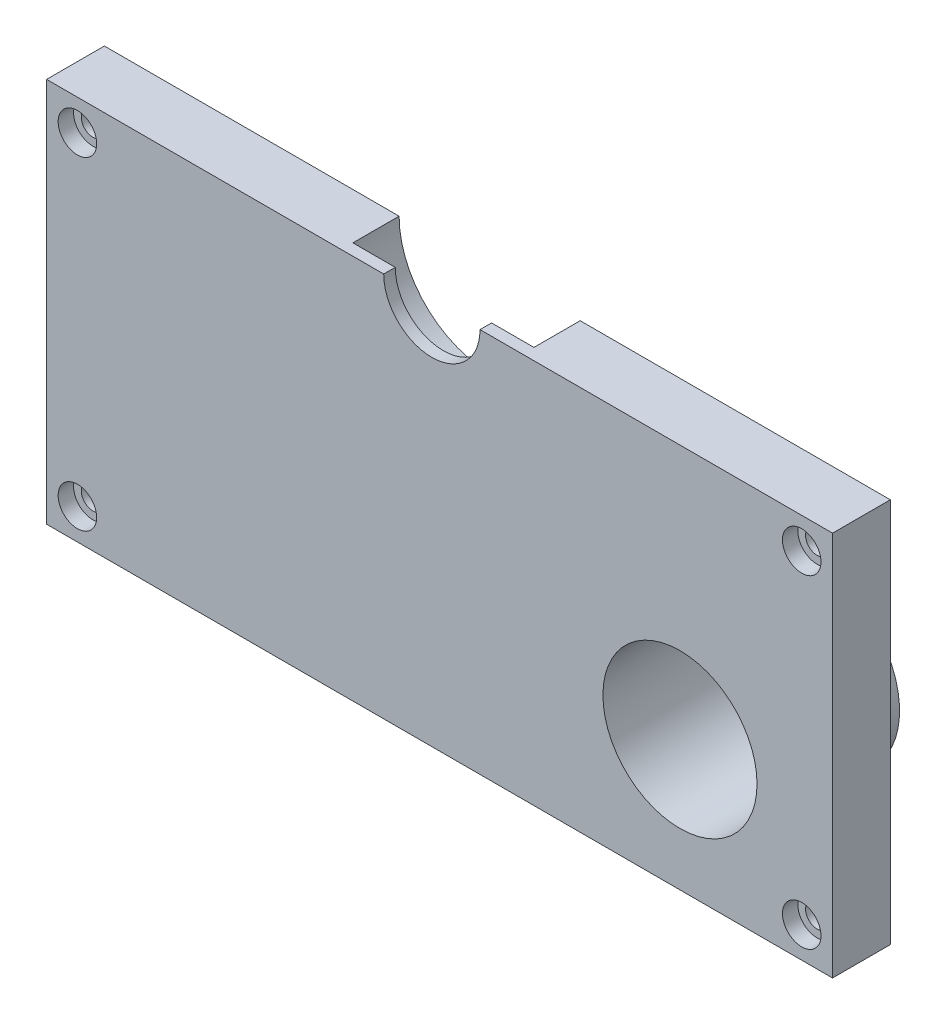
ISO-10303-21;
HEADER;
FILE_DESCRIPTION(('STEP AP214'),'2;1');
FILE_NAME('part.step','',(''),(''),'','','');
FILE_SCHEMA(('AUTOMOTIVE_DESIGN { 1 0 10303 214 1 1 1 1 }'));
ENDSEC;
DATA;
#1=APPLICATION_CONTEXT('core data for automotive mechanical design processes');
#2=APPLICATION_PROTOCOL_DEFINITION('international standard','automotive_design',2000,#1);
#3=PRODUCT_CONTEXT('',#1,'mechanical');
#4=PRODUCT('Part','Part','',(#3));
#5=PRODUCT_RELATED_PRODUCT_CATEGORY('part','',(#4));
#6=PRODUCT_DEFINITION_FORMATION('','',#4);
#7=PRODUCT_DEFINITION_CONTEXT('part definition',#1,'design');
#8=PRODUCT_DEFINITION('design','',#6,#7);
#9=PRODUCT_DEFINITION_SHAPE('','',#8);
#10=(LENGTH_UNIT() NAMED_UNIT(*) SI_UNIT(.MILLI.,.METRE.));
#11=(NAMED_UNIT(*) PLANE_ANGLE_UNIT() SI_UNIT($,.RADIAN.));
#12=(NAMED_UNIT(*) SI_UNIT($,.STERADIAN.) SOLID_ANGLE_UNIT());
#13=UNCERTAINTY_MEASURE_WITH_UNIT(LENGTH_MEASURE(1.E-05),#10,'distance_accuracy_value','');
#14=(GEOMETRIC_REPRESENTATION_CONTEXT(3) GLOBAL_UNCERTAINTY_ASSIGNED_CONTEXT((#13)) GLOBAL_UNIT_ASSIGNED_CONTEXT((#10,
#11,#12)) REPRESENTATION_CONTEXT('',''));
#15=CARTESIAN_POINT('',(0.,0.,0.));
#16=DIRECTION('',(0.,0.,1.));
#17=DIRECTION('',(1.,0.,0.));
#18=AXIS2_PLACEMENT_3D('',#15,#16,#17);
#19=CARTESIAN_POINT('',(0.,0.,4.5));
#20=DIRECTION('',(0.,0.,1.));
#21=DIRECTION('',(1.,0.,0.));
#22=AXIS2_PLACEMENT_3D('',#19,#20,#21);
#23=PLANE('',#22);
#24=CARTESIAN_POINT('',(32.2,-33.1,4.5));
#25=DIRECTION('',(0.,0.,1.));
#26=DIRECTION('',(1.,0.,0.));
#27=AXIS2_PLACEMENT_3D('',#24,#25,#26);
#28=CIRCLE('',#27,10.);
#29=CARTESIAN_POINT('',(42.2,-33.1,4.5));
#30=VERTEX_POINT('',#29);
#31=EDGE_CURVE('E380',#30,#30,#28,.F.);
#32=ORIENTED_EDGE('',*,*,#31,.T.);
#33=EDGE_LOOP('',(#32));
#34=FACE_BOUND('',#33,.T.);
#35=DIRECTION('',(-1.,0.,0.));
#36=VECTOR('',#35,1.);
#37=CARTESIAN_POINT('',(-11.25,0.,4.5));
#38=LINE('',#37,#36);
#39=CARTESIAN_POINT('',(-6.25,0.,4.5));
#40=VERTEX_POINT('',#39);
#41=CARTESIAN_POINT('',(-50.,0.,4.5));
#42=VERTEX_POINT('',#41);
#43=EDGE_CURVE('E85',#40,#42,#38,.T.);
#44=ORIENTED_EDGE('',*,*,#43,.T.);
#45=DIRECTION('',(0.,-1.,0.));
#46=VECTOR('',#45,1.);
#47=CARTESIAN_POINT('',(-50.,0.,4.5));
#48=LINE('',#47,#46);
#49=CARTESIAN_POINT('',(-50.,-50.,4.5));
#50=VERTEX_POINT('',#49);
#51=EDGE_CURVE('E183',#42,#50,#48,.T.);
#52=ORIENTED_EDGE('',*,*,#51,.T.);
#53=DIRECTION('',(1.,0.,0.));
#54=VECTOR('',#53,1.);
#55=CARTESIAN_POINT('',(-50.,-50.,4.5));
#56=LINE('',#55,#54);
#57=CARTESIAN_POINT('',(52.,-50.,4.5));
#58=VERTEX_POINT('',#57);
#59=EDGE_CURVE('E77',#50,#58,#56,.T.);
#60=ORIENTED_EDGE('',*,*,#59,.T.);
#61=DIRECTION('',(0.,-1.,0.));
#62=VECTOR('',#61,1.);
#63=CARTESIAN_POINT('',(52.,-50.,4.5));
#64=LINE('',#63,#62);
#65=CARTESIAN_POINT('',(52.,0.,4.5));
#66=VERTEX_POINT('',#65);
#67=EDGE_CURVE('E193',#66,#58,#64,.T.);
#68=ORIENTED_EDGE('',*,*,#67,.F.);
#69=DIRECTION('',(-1.,0.,0.));
#70=VECTOR('',#69,1.);
#71=CARTESIAN_POINT('',(70.,0.,4.5));
#72=LINE('',#71,#70);
#73=CARTESIAN_POINT('',(6.25,0.,4.5));
#74=VERTEX_POINT('',#73);
#75=EDGE_CURVE('E187',#66,#74,#72,.T.);
#76=ORIENTED_EDGE('',*,*,#75,.T.);
#77=CARTESIAN_POINT('',(0.,0.,4.5));
#78=DIRECTION('',(0.,0.,-1.));
#79=DIRECTION('',(1.,0.,0.));
#80=AXIS2_PLACEMENT_3D('',#77,#78,#79);
#81=CIRCLE('',#80,6.25);
#82=EDGE_CURVE('E93',#74,#40,#81,.T.);
#83=ORIENTED_EDGE('',*,*,#82,.T.);
#84=EDGE_LOOP('',(#44,#52,#60,#68,#76,#83));
#85=FACE_BOUND('',#84,.T.);
#86=CARTESIAN_POINT('',(48.,-46.,4.5));
#87=DIRECTION('',(0.,0.,1.));
#88=DIRECTION('',(1.,0.,0.));
#89=AXIS2_PLACEMENT_3D('',#86,#87,#88);
#90=CIRCLE('',#89,2.5);
#91=CARTESIAN_POINT('',(50.5,-46.,4.5));
#92=VERTEX_POINT('',#91);
#93=EDGE_CURVE('E148',#92,#92,#90,.T.);
#94=ORIENTED_EDGE('',*,*,#93,.F.);
#95=EDGE_LOOP('',(#94));
#96=FACE_BOUND('',#95,.T.);
#97=CARTESIAN_POINT('',(48.,-4.,4.5));
#98=DIRECTION('',(0.,0.,1.));
#99=DIRECTION('',(1.,0.,0.));
#100=AXIS2_PLACEMENT_3D('',#97,#98,#99);
#101=CIRCLE('',#100,2.5);
#102=CARTESIAN_POINT('',(50.5,-4.,4.5));
#103=VERTEX_POINT('',#102);
#104=EDGE_CURVE('E153',#103,#103,#101,.T.);
#105=ORIENTED_EDGE('',*,*,#104,.F.);
#106=EDGE_LOOP('',(#105));
#107=FACE_BOUND('',#106,.T.);
#108=CARTESIAN_POINT('',(-46.,-4.,4.5));
#109=DIRECTION('',(0.,0.,1.));
#110=DIRECTION('',(1.,0.,0.));
#111=AXIS2_PLACEMENT_3D('',#108,#109,#110);
#112=CIRCLE('',#111,2.5);
#113=CARTESIAN_POINT('',(-43.5,-4.,4.5));
#114=VERTEX_POINT('',#113);
#115=EDGE_CURVE('E158',#114,#114,#112,.T.);
#116=ORIENTED_EDGE('',*,*,#115,.F.);
#117=EDGE_LOOP('',(#116));
#118=FACE_BOUND('',#117,.T.);
#119=CARTESIAN_POINT('',(-46.,-46.,4.5));
#120=DIRECTION('',(0.,0.,1.));
#121=DIRECTION('',(1.,0.,0.));
#122=AXIS2_PLACEMENT_3D('',#119,#120,#121);
#123=CIRCLE('',#122,2.5);
#124=CARTESIAN_POINT('',(-43.5,-46.,4.5));
#125=VERTEX_POINT('',#124);
#126=EDGE_CURVE('E143',#125,#125,#123,.T.);
#127=ORIENTED_EDGE('',*,*,#126,.F.);
#128=EDGE_LOOP('',(#127));
#129=FACE_BOUND('',#128,.T.);
#130=ADVANCED_FACE('F35',(#34,#85,#96,#107,#118,#129),#23,.T.);
#131=CARTESIAN_POINT('',(32.2,-33.1,42.1126983722081));
#132=DIRECTION('',(0.,0.,-1.));
#133=DIRECTION('',(-1.,0.,0.));
#134=AXIS2_PLACEMENT_3D('',#131,#132,#133);
#135=CYLINDRICAL_SURFACE('',#134,11.);
#136=CARTESIAN_POINT('',(32.2,-22.1,-9.50000000000001));
#137=CARTESIAN_POINT('',(32.1161615865701,-22.1000012532738,-9.49999648054263));
#138=CARTESIAN_POINT('',(32.0322723977102,-22.1009685728513,-9.49294740732744));
#139=CARTESIAN_POINT('',(31.8668329023586,-22.1047343359155,-9.46494111677572));
#140=CARTESIAN_POINT('',(31.7852850543401,-22.107534635599,-9.44396980055017));
#141=CARTESIAN_POINT('',(31.6269469063064,-22.1146512260171,-9.38875226615938));
#142=CARTESIAN_POINT('',(31.5501532775468,-22.1189664416081,-9.35451546079792));
#143=CARTESIAN_POINT('',(31.4034146975503,-22.128634272777,-9.27376047543979));
#144=CARTESIAN_POINT('',(31.3334686711413,-22.1339867250995,-9.22724422774572));
#145=CARTESIAN_POINT('',(31.2019424361877,-22.1451714003075,-9.12292778570769));
#146=CARTESIAN_POINT('',(31.1404132153762,-22.1510062309478,-9.06506357699654));
#147=CARTESIAN_POINT('',(31.0279066609196,-22.1624772844068,-8.93983138920762));
#148=CARTESIAN_POINT('',(30.976929893872,-22.1681134965475,-8.87246290013868));
#149=CARTESIAN_POINT('',(30.8867814947508,-22.1785746222812,-8.72979806177589));
#150=CARTESIAN_POINT('',(30.847658335316,-22.183396169892,-8.65447081499479));
#151=CARTESIAN_POINT('',(30.7826373551472,-22.1916470593224,-8.49823818462633));
#152=CARTESIAN_POINT('',(30.7567389389201,-22.195076463827,-8.4173330523902));
#153=CARTESIAN_POINT('',(30.7190590944491,-22.2001295030783,-8.25277375642641));
#154=CARTESIAN_POINT('',(30.7071910113545,-22.2017642177551,-8.16913978070894));
#155=CARTESIAN_POINT('',(30.6976404494033,-22.2030765619518,-8.00105252697592));
#156=CARTESIAN_POINT('',(30.6999572950202,-22.2027542846692,-7.91659928816724));
#157=CARTESIAN_POINT('',(30.7186398298076,-22.2001991966344,-7.7498782743991));
#158=CARTESIAN_POINT('',(30.7349096108241,-22.1979794289804,-7.66759952363283));
#159=CARTESIAN_POINT('',(30.780886323047,-22.1918998259182,-7.50695095946735));
#160=CARTESIAN_POINT('',(30.8105935734975,-22.188039951545,-7.42858123898703));
#161=CARTESIAN_POINT('',(30.8827035823979,-22.179100417063,-7.27768007396237));
#162=CARTESIAN_POINT('',(30.9251475614224,-22.1740168072425,-7.20516857073199));
#163=CARTESIAN_POINT('',(31.0214967695518,-22.1632055566531,-7.06826085111422));
#164=CARTESIAN_POINT('',(31.0754026217696,-22.1574778808782,-7.00386507623326));
#165=CARTESIAN_POINT('',(31.193674722162,-22.145966026102,-6.88446044550542));
#166=CARTESIAN_POINT('',(31.2581235492658,-22.1401817705892,-6.82953335968757));
#167=CARTESIAN_POINT('',(31.3953690555946,-22.1292525294221,-6.73126350840162));
#168=CARTESIAN_POINT('',(31.4681657608354,-22.1241075457602,-6.68792077903695));
#169=CARTESIAN_POINT('',(31.6201070305195,-22.1150324591229,-6.61404813681996));
#170=CARTESIAN_POINT('',(31.6992543678687,-22.1111028905153,-6.58352385760728));
#171=CARTESIAN_POINT('',(31.8616169120601,-22.1049060479693,-6.5362221620544));
#172=CARTESIAN_POINT('',(31.9448318917199,-22.102638681308,-6.51944397890651));
#173=CARTESIAN_POINT('',(32.1122610926323,-22.1000338619625,-6.50021791543441));
#174=CARTESIAN_POINT('',(32.1964621636121,-22.0996812530986,-6.49765749141139));
#175=CARTESIAN_POINT('',(32.3640922940892,-22.1009046122902,-6.50664187833073));
#176=CARTESIAN_POINT('',(32.4475213731804,-22.1024805312617,-6.51818633028291));
#177=CARTESIAN_POINT('',(32.6109033783649,-22.1073744734208,-6.55495922320966));
#178=CARTESIAN_POINT('',(32.6908687206206,-22.1106855987668,-6.58013349557132));
#179=CARTESIAN_POINT('',(32.8454431410956,-22.1186795593637,-6.64339475903291));
#180=CARTESIAN_POINT('',(32.9200520064252,-22.1233624490969,-6.68148226301717));
#181=CARTESIAN_POINT('',(33.0622948929825,-22.1336163696397,-6.76975753872403));
#182=CARTESIAN_POINT('',(33.1298837283532,-22.139192629429,-6.82001750280037));
#183=CARTESIAN_POINT('',(33.2557070132546,-22.1505944685733,-6.93110957795735));
#184=CARTESIAN_POINT('',(33.3139410174533,-22.1564200597808,-6.99194219205666));
#185=CARTESIAN_POINT('',(33.4198053295411,-22.1677113122697,-7.1229508330084));
#186=CARTESIAN_POINT('',(33.4673606638064,-22.1731742498786,-7.19318771348107));
#187=CARTESIAN_POINT('',(33.5499983954927,-22.1830753495584,-7.34071830769976));
#188=CARTESIAN_POINT('',(33.5850810819614,-22.1875135353766,-7.41801185785857));
#189=CARTESIAN_POINT('',(33.6416584950515,-22.1948435273933,-7.57722775667319));
#190=CARTESIAN_POINT('',(33.6631942705001,-22.197740001028,-7.65913529443613));
#191=CARTESIAN_POINT('',(33.6921981054752,-22.2016715683977,-7.82544652182803));
#192=CARTESIAN_POINT('',(33.699666954979,-22.2027067666591,-7.90985007101435));
#193=CARTESIAN_POINT('',(33.7003085658472,-22.2027951458473,-8.07801097539096));
#194=CARTESIAN_POINT('',(33.6935991469064,-22.2018646613795,-8.1617678966084));
#195=CARTESIAN_POINT('',(33.6663254643853,-22.1981617994635,-8.32695113869849));
#196=CARTESIAN_POINT('',(33.6457612087119,-22.1953894230665,-8.40837746090115));
#197=CARTESIAN_POINT('',(33.5914005645048,-22.1883204918021,-8.56656513938514));
#198=CARTESIAN_POINT('',(33.5576109698069,-22.1840247196071,-8.64332886748254));
#199=CARTESIAN_POINT('',(33.4777703983912,-22.174391888755,-8.79011629860636));
#200=CARTESIAN_POINT('',(33.4317191536582,-22.1690548073377,-8.86013985426055));
#201=CARTESIAN_POINT('',(33.3282291522308,-22.1578877007815,-8.99206003659979));
#202=CARTESIAN_POINT('',(33.270702784234,-22.1520540943964,-9.05388763622252));
#203=CARTESIAN_POINT('',(33.1460798680536,-22.1405821269644,-9.16705534671079));
#204=CARTESIAN_POINT('',(33.0789810819578,-22.1349438119584,-9.21839299831137));
#205=CARTESIAN_POINT('',(32.936765493202,-22.1244690703008,-9.30932596738337));
#206=CARTESIAN_POINT('',(32.8616138185174,-22.1196363835438,-9.34886715827633));
#207=CARTESIAN_POINT('',(32.7057096939303,-22.1113546294284,-9.41470948105298));
#208=CARTESIAN_POINT('',(32.6249633120219,-22.1079040897228,-9.44102470969371));
#209=CARTESIAN_POINT('',(32.4865185970872,-22.1035882393269,-9.47351043706395));
#210=CARTESIAN_POINT('',(32.4296857886961,-22.1022493572114,-9.48342936079735));
#211=CARTESIAN_POINT('',(32.3152433136469,-22.1004548109262,-9.49667532098122));
#212=CARTESIAN_POINT('',(32.2576336542977,-22.0999991384528,-9.50000241940636));
#213=CARTESIAN_POINT('',(32.2,-22.1,-9.50000000000001));
#214=B_SPLINE_CURVE_WITH_KNOTS('',3,(#136,#137,#138,#139,#140,#141,#142,#143,#144,#145,#146,
#147,#148,#149,#150,#151,#152,#153,#154,#155,#156,#157,#158,#159,#160,#161,#162,#163,#164,#165,
#166,#167,#168,#169,#170,#171,#172,#173,#174,#175,#176,#177,#178,#179,#180,#181,#182,#183,#184,
#185,#186,#187,#188,#189,#190,#191,#192,#193,#194,#195,#196,#197,#198,#199,#200,#201,#202,#203,
#204,#205,#206,#207,#208,#209,#210,#211,#212,#213),.UNSPECIFIED.,.T.,.F.,(4,2,2,2,2,2,2,2,2,2,2,
2,2,2,2,2,2,2,2,2,2,2,2,2,2,2,2,2,2,2,2,2,2,2,2,2,2,2,4),(0.,0.251304688086151,
0.502864258429492,0.754245655375319,1.00558751830525,1.25839025869503,1.51120656941612,
1.76504317927172,2.0188683581839,2.27111752000618,2.52335466910192,2.77387178872724,
3.02439486038875,3.27573762185035,3.52709405079555,3.7805228474684,4.03395243396011,
4.28749328511463,4.54101999186671,4.79253696204825,5.0440475308801,5.29456578809545,
5.54509399649484,5.79714607697894,6.04921015271755,6.3029921512941,6.55676826820731,
6.80977166004954,7.06276084317862,7.31365598745062,7.56455098853994,7.81531727406243,
8.06608904128422,8.31885423544372,8.57167862009412,8.8256458202468,9.07934175494261,
9.25209960062624,9.42485582207676),.UNSPECIFIED.);
#215=CARTESIAN_POINT('',(32.2,-22.1,-9.50000000000001));
#216=VERTEX_POINT('',#215);
#217=EDGE_CURVE('E44',#216,#216,#214,.T.);
#218=ORIENTED_EDGE('',*,*,#217,.T.);
#219=EDGE_LOOP('',(#218));
#220=FACE_BOUND('',#219,.T.);
#221=ADVANCED_FACE('F252',(#220),#135,.T.);
#222=CARTESIAN_POINT('',(32.2,-18.,-8.));
#223=DIRECTION('',(0.,-1.,0.));
#224=DIRECTION('',(0.,0.,-1.));
#225=AXIS2_PLACEMENT_3D('',#222,#223,#224);
#226=CYLINDRICAL_SURFACE('',#225,1.5);
#227=CARTESIAN_POINT('',(32.2,-18.,-8.));
#228=DIRECTION('',(0.,1.,0.));
#229=DIRECTION('',(0.,0.,1.));
#230=AXIS2_PLACEMENT_3D('',#227,#228,#229);
#231=CIRCLE('',#230,1.5);
#232=CARTESIAN_POINT('',(32.2,-18.,-6.5));
#233=VERTEX_POINT('',#232);
#234=EDGE_CURVE('E231',#233,#233,#231,.T.);
#235=ORIENTED_EDGE('',*,*,#234,.T.);
#236=EDGE_LOOP('',(#235));
#237=FACE_BOUND('',#236,.T.);
#238=ORIENTED_EDGE('',*,*,#217,.F.);
#239=EDGE_LOOP('',(#238));
#240=FACE_BOUND('',#239,.T.);
#241=ADVANCED_FACE('F37',(#237,#240),#226,.F.);
#242=CARTESIAN_POINT('',(32.2,-18.,-8.));
#243=DIRECTION('',(0.,1.,0.));
#244=DIRECTION('',(0.,0.,1.));
#245=AXIS2_PLACEMENT_3D('',#242,#243,#244);
#246=PLANE('',#245);
#247=CARTESIAN_POINT('',(32.2,-18.,-8.));
#248=DIRECTION('',(0.,1.,0.));
#249=DIRECTION('',(0.,0.,1.));
#250=AXIS2_PLACEMENT_3D('',#247,#248,#249);
#251=CIRCLE('',#250,3.);
#252=CARTESIAN_POINT('',(32.2,-18.,-5.));
#253=VERTEX_POINT('',#252);
#254=EDGE_CURVE('E636',#253,#253,#251,.T.);
#255=ORIENTED_EDGE('',*,*,#254,.T.);
#256=EDGE_LOOP('',(#255));
#257=FACE_BOUND('',#256,.T.);
#258=ORIENTED_EDGE('',*,*,#234,.F.);
#259=EDGE_LOOP('',(#258));
#260=FACE_BOUND('',#259,.T.);
#261=ADVANCED_FACE('F243',(#257,#260),#246,.T.);
#262=CARTESIAN_POINT('',(32.2,-18.,-8.));
#263=DIRECTION('',(0.,-1.,0.));
#264=DIRECTION('',(0.,0.,-1.));
#265=AXIS2_PLACEMENT_3D('',#262,#263,#264);
#266=CYLINDRICAL_SURFACE('',#265,3.);
#267=ORIENTED_EDGE('',*,*,#254,.F.);
#268=EDGE_LOOP('',(#267));
#269=FACE_BOUND('',#268,.T.);
#270=CARTESIAN_POINT('',(32.2,-22.1,-11.));
#271=CARTESIAN_POINT('',(32.0347581733356,-22.1000023456518,-10.9999963747779));
#272=CARTESIAN_POINT('',(31.8694780423746,-22.1037598547848,-10.9863018728332));
#273=CARTESIAN_POINT('',(31.5436881396846,-22.118384038291,-10.9319883393936));
#274=CARTESIAN_POINT('',(31.3831805440455,-22.12925390519,-10.8913572167428));
#275=CARTESIAN_POINT('',(31.0716847478892,-22.1569045565173,-10.7845965365232));
#276=CARTESIAN_POINT('',(30.9206842660597,-22.1736775226121,-10.7185006946762));
#277=CARTESIAN_POINT('',(30.6319110076806,-22.2113669117431,-10.5628141346752));
#278=CARTESIAN_POINT('',(30.4941392734204,-22.2322836608697,-10.4732215672921));
#279=CARTESIAN_POINT('',(30.2324061048535,-22.2765720591588,-10.2708003270655));
#280=CARTESIAN_POINT('',(30.1088097416601,-22.2999871701914,-10.1575091182916));
#281=CARTESIAN_POINT('',(29.8821141263504,-22.3463577412988,-9.9118947279402));
#282=CARTESIAN_POINT('',(29.7790176435056,-22.3693131388959,-9.77956897919538));
#283=CARTESIAN_POINT('',(29.59444410921,-22.4126123167268,-9.49669750484106));
#284=CARTESIAN_POINT('',(29.5133914632483,-22.4329013988275,-9.34586571012744));
#285=CARTESIAN_POINT('',(29.3779416727754,-22.4679298517617,-9.03207234360125));
#286=CARTESIAN_POINT('',(29.3235393610631,-22.4826702982849,-8.86911313022302));
#287=CARTESIAN_POINT('',(29.2442108711746,-22.5044830561452,-8.53974420997507));
#288=CARTESIAN_POINT('',(29.2186207891354,-22.5117277543243,-8.37350610367617));
#289=CARTESIAN_POINT('',(29.1955727118173,-22.5182434183184,-8.03895063398238));
#290=CARTESIAN_POINT('',(29.1981091971823,-22.5175159485348,-7.87063368499996));
#291=CARTESIAN_POINT('',(29.230716164394,-22.5083235024909,-7.54191689806746));
#292=CARTESIAN_POINT('',(29.2599785266213,-22.5000856337266,-7.38142953079553));
#293=CARTESIAN_POINT('',(29.3439103225639,-22.4771648841188,-7.06773342795438));
#294=CARTESIAN_POINT('',(29.398581869907,-22.4624814671169,-6.91452529906741));
#295=CARTESIAN_POINT('',(29.5324274034706,-22.4281276341535,-6.61765295890509));
#296=CARTESIAN_POINT('',(29.611880962341,-22.4084008047172,-6.47412159793276));
#297=CARTESIAN_POINT('',(29.7928402395565,-22.3662126240442,-6.20214710518067));
#298=CARTESIAN_POINT('',(29.8943504778758,-22.343750712735,-6.07370707432251));
#299=CARTESIAN_POINT('',(30.1206530663421,-22.2976821001879,-5.83094962038713));
#300=CARTESIAN_POINT('',(30.2461227076655,-22.2740625140577,-5.71726510142212));
#301=CARTESIAN_POINT('',(30.5146359764227,-22.2290270458404,-5.51241807004442));
#302=CARTESIAN_POINT('',(30.6576803605629,-22.2076112587142,-5.42125652790076));
#303=CARTESIAN_POINT('',(30.9582920925207,-22.1692544375748,-5.26374665445015));
#304=CARTESIAN_POINT('',(31.1159247251644,-22.1523349742539,-5.19751732283211));
#305=CARTESIAN_POINT('',(31.4406546225712,-22.1250328771478,-5.09268405497171));
#306=CARTESIAN_POINT('',(31.6077497113646,-22.1146487471087,-5.05407379511172));
#307=CARTESIAN_POINT('',(31.9412636590335,-22.1018154244738,-5.00657876440605));
#308=CARTESIAN_POINT('',(32.107551404432,-22.0991367374926,-4.99683400935927));
#309=CARTESIAN_POINT('',(32.4393867312759,-22.1013539682973,-5.00496549502686));
#310=CARTESIAN_POINT('',(32.604934391065,-22.1062490643399,-5.02283873923299));
#311=CARTESIAN_POINT('',(32.9274901954791,-22.122915214681,-5.08499500540627));
#312=CARTESIAN_POINT('',(33.0845986485453,-22.1345602705581,-5.12879438551397));
#313=CARTESIAN_POINT('',(33.3892197348973,-22.1634015292865,-5.24099448928101));
#314=CARTESIAN_POINT('',(33.53673130261,-22.1805983473082,-5.30939793932271));
#315=CARTESIAN_POINT('',(33.8212823223891,-22.2191685234369,-5.47043288457121));
#316=CARTESIAN_POINT('',(33.958049204825,-22.2406194090113,-5.56352697452255));
#317=CARTESIAN_POINT('',(34.2143204402618,-22.2852202317904,-5.77072257509104));
#318=CARTESIAN_POINT('',(34.333821212356,-22.3083705199458,-5.88482843231709));
#319=CARTESIAN_POINT('',(34.5558212068855,-22.3546119688643,-6.13482807606764));
#320=CARTESIAN_POINT('',(34.6577125549415,-22.3776811004517,-6.27126676454985));
#321=CARTESIAN_POINT('',(34.8371716441621,-22.4203994761144,-6.55979729444655));
#322=CARTESIAN_POINT('',(34.9147403585293,-22.4400488570075,-6.71188850924513));
#323=CARTESIAN_POINT('',(35.0427711663376,-22.4734750264053,-7.02668125646437));
#324=CARTESIAN_POINT('',(35.0933870461064,-22.4872850377454,-7.18931652096057));
#325=CARTESIAN_POINT('',(35.1664183443807,-22.5074637076588,-7.52123367595563));
#326=CARTESIAN_POINT('',(35.1888413772566,-22.513834375429,-7.69051375906857));
#327=CARTESIAN_POINT('',(35.2043979115442,-22.5182398065005,-8.02467680767057));
#328=CARTESIAN_POINT('',(35.1985106643339,-22.5165532811915,-8.18951117749585));
#329=CARTESIAN_POINT('',(35.1598967528693,-22.5056899667092,-8.51574129550562));
#330=CARTESIAN_POINT('',(35.1271708405703,-22.4965133873894,-8.67713713989941));
#331=CARTESIAN_POINT('',(35.0363881687061,-22.4718736697809,-8.99061263153778));
#332=CARTESIAN_POINT('',(34.9785479089835,-22.4564643373809,-9.14275950647964));
#333=CARTESIAN_POINT('',(34.8393460908267,-22.4210962003435,-9.43530655363056));
#334=CARTESIAN_POINT('',(34.7579806900888,-22.4011366526434,-9.5757048021314));
#335=CARTESIAN_POINT('',(34.5711086196973,-22.3581524123349,-9.8454211953842));
#336=CARTESIAN_POINT('',(34.4649380364426,-22.3350524830871,-9.97426740968593));
#337=CARTESIAN_POINT('',(34.2327202239854,-22.2888001901906,-10.2126328135895));
#338=CARTESIAN_POINT('',(34.106668118776,-22.265647815056,-10.3221472480107));
#339=CARTESIAN_POINT('',(33.8348154513722,-22.2212708164507,-10.5211892290387));
#340=CARTESIAN_POINT('',(33.688631732525,-22.2001018449233,-10.6102069617339));
#341=CARTESIAN_POINT('',(33.3827997996786,-22.1626947243925,-10.762264872423));
#342=CARTESIAN_POINT('',(33.2231599048424,-22.1464535569762,-10.8253209611087));
#343=CARTESIAN_POINT('',(32.9202002024364,-22.1227161200847,-10.915879019958));
#344=CARTESIAN_POINT('',(32.7781292805249,-22.1142610463782,-10.9473491024834));
#345=CARTESIAN_POINT('',(32.490715215883,-22.102902256713,-10.9894100506377));
#346=CARTESIAN_POINT('',(32.3453724311299,-22.0999979363996,-11.0000031893096));
#347=CARTESIAN_POINT('',(32.2,-22.1,-11.));
#348=B_SPLINE_CURVE_WITH_KNOTS('',3,(#270,#271,#272,#273,#274,#275,#276,#277,#278,#279,#280,
#281,#282,#283,#284,#285,#286,#287,#288,#289,#290,#291,#292,#293,#294,#295,#296,#297,#298,#299,
#300,#301,#302,#303,#304,#305,#306,#307,#308,#309,#310,#311,#312,#313,#314,#315,#316,#317,#318,
#319,#320,#321,#322,#323,#324,#325,#326,#327,#328,#329,#330,#331,#332,#333,#334,#335,#336,#337,
#338,#339,#340,#341,#342,#343,#344,#345,#346,#347),.UNSPECIFIED.,.T.,.F.,(4,2,2,2,2,2,2,2,2,2,2,
2,2,2,2,2,2,2,2,2,2,2,2,2,2,2,2,2,2,2,2,2,2,2,2,2,2,2,4),(0.,0.495192213709797,0.9906068571026,
1.48536780484116,1.98016770272941,2.48571756446357,2.99133567318647,3.50609187300439,
4.02074822781993,4.52328609721851,5.02572535393076,5.51345773349774,6.00123069167434,
6.49471853535856,6.98830760278243,7.4987705710155,8.00925552568848,8.52214699472057,
9.03492099533888,9.53225622686166,10.029537502105,10.5178222240039,11.0061610695167,
11.5043893801936,12.0027208731201,12.5158014612974,13.0288615173582,13.5389619291417,
14.0489245425547,14.5413770446734,15.0338157499215,15.5220911132461,16.0104462704815,
16.5137802279716,17.0172378222293,17.532117445911,18.0466810522785,18.4823766419936,
18.9180247913559),.UNSPECIFIED.);
#349=CARTESIAN_POINT('',(32.2,-22.1,-11.));
#350=VERTEX_POINT('',#349);
#351=EDGE_CURVE('E220',#350,#350,#348,.T.);
#352=ORIENTED_EDGE('',*,*,#351,.T.);
#353=EDGE_LOOP('',(#352));
#354=FACE_BOUND('',#353,.T.);
#355=ADVANCED_FACE('F239',(#269,#354),#266,.T.);
#356=CARTESIAN_POINT('',(-46.,-46.,-5.5));
#357=DIRECTION('',(0.,0.,1.));
#358=DIRECTION('',(1.,0.,0.));
#359=AXIS2_PLACEMENT_3D('',#356,#357,#358);
#360=CYLINDRICAL_SURFACE('',#359,1.5);
#361=CARTESIAN_POINT('',(-46.,-46.,-3.));
#362=DIRECTION('',(0.,0.,-1.));
#363=DIRECTION('',(-1.,0.,0.));
#364=AXIS2_PLACEMENT_3D('',#361,#362,#363);
#365=CIRCLE('',#364,1.5);
#366=CARTESIAN_POINT('',(-47.5,-46.,-3.));
#367=VERTEX_POINT('',#366);
#368=EDGE_CURVE('E136',#367,#367,#365,.T.);
#369=ORIENTED_EDGE('',*,*,#368,.T.);
#370=EDGE_LOOP('',(#369));
#371=FACE_BOUND('',#370,.T.);
#372=CARTESIAN_POINT('',(-46.,-46.,2.5));
#373=DIRECTION('',(0.,0.,1.));
#374=DIRECTION('',(1.,0.,0.));
#375=AXIS2_PLACEMENT_3D('',#372,#373,#374);
#376=CIRCLE('',#375,1.5);
#377=CARTESIAN_POINT('',(-44.5,-46.,2.5));
#378=VERTEX_POINT('',#377);
#379=EDGE_CURVE('E140',#378,#378,#376,.F.);
#380=ORIENTED_EDGE('',*,*,#379,.F.);
#381=EDGE_LOOP('',(#380));
#382=FACE_BOUND('',#381,.T.);
#383=ADVANCED_FACE('F242',(#371,#382),#360,.F.);
#384=CARTESIAN_POINT('',(-46.,-46.,2.5));
#385=DIRECTION('',(0.,0.,1.));
#386=DIRECTION('',(1.,0.,0.));
#387=AXIS2_PLACEMENT_3D('',#384,#385,#386);
#388=PLANE('',#387);
#389=CARTESIAN_POINT('',(-46.,-46.,2.5));
#390=DIRECTION('',(0.,0.,1.));
#391=DIRECTION('',(1.,0.,0.));
#392=AXIS2_PLACEMENT_3D('',#389,#390,#391);
#393=CIRCLE('',#392,2.5);
#394=CARTESIAN_POINT('',(-43.5,-46.,2.5));
#395=VERTEX_POINT('',#394);
#396=EDGE_CURVE('E144',#395,#395,#393,.T.);
#397=ORIENTED_EDGE('',*,*,#396,.T.);
#398=EDGE_LOOP('',(#397));
#399=FACE_BOUND('',#398,.T.);
#400=ORIENTED_EDGE('',*,*,#379,.T.);
#401=EDGE_LOOP('',(#400));
#402=FACE_BOUND('',#401,.T.);
#403=ADVANCED_FACE('F306',(#399,#402),#388,.T.);
#404=CARTESIAN_POINT('',(-46.,-46.,2.5));
#405=DIRECTION('',(0.,0.,1.));
#406=DIRECTION('',(1.,0.,0.));
#407=AXIS2_PLACEMENT_3D('',#404,#405,#406);
#408=CYLINDRICAL_SURFACE('',#407,2.5);
#409=ORIENTED_EDGE('',*,*,#396,.F.);
#410=EDGE_LOOP('',(#409));
#411=FACE_BOUND('',#410,.T.);
#412=ORIENTED_EDGE('',*,*,#126,.T.);
#413=EDGE_LOOP('',(#412));
#414=FACE_BOUND('',#413,.T.);
#415=ADVANCED_FACE('F311',(#411,#414),#408,.F.);
#416=CARTESIAN_POINT('',(-46.,-4.,-5.5));
#417=DIRECTION('',(0.,0.,1.));
#418=DIRECTION('',(1.,0.,0.));
#419=AXIS2_PLACEMENT_3D('',#416,#417,#418);
#420=CYLINDRICAL_SURFACE('',#419,1.5);
#421=CARTESIAN_POINT('',(-46.,-4.,-3.));
#422=DIRECTION('',(0.,0.,-1.));
#423=DIRECTION('',(-1.,0.,0.));
#424=AXIS2_PLACEMENT_3D('',#421,#422,#423);
#425=CIRCLE('',#424,1.5);
#426=CARTESIAN_POINT('',(-47.5,-4.,-3.));
#427=VERTEX_POINT('',#426);
#428=EDGE_CURVE('E172',#427,#427,#425,.T.);
#429=ORIENTED_EDGE('',*,*,#428,.T.);
#430=EDGE_LOOP('',(#429));
#431=FACE_BOUND('',#430,.T.);
#432=CARTESIAN_POINT('',(-46.,-4.,2.5));
#433=DIRECTION('',(0.,0.,1.));
#434=DIRECTION('',(1.,0.,0.));
#435=AXIS2_PLACEMENT_3D('',#432,#433,#434);
#436=CIRCLE('',#435,1.5);
#437=CARTESIAN_POINT('',(-44.5,-4.,2.5));
#438=VERTEX_POINT('',#437);
#439=EDGE_CURVE('E155',#438,#438,#436,.F.);
#440=ORIENTED_EDGE('',*,*,#439,.F.);
#441=EDGE_LOOP('',(#440));
#442=FACE_BOUND('',#441,.T.);
#443=ADVANCED_FACE('F318',(#431,#442),#420,.F.);
#444=CARTESIAN_POINT('',(-46.,-4.,2.5));
#445=DIRECTION('',(0.,0.,1.));
#446=DIRECTION('',(1.,0.,0.));
#447=AXIS2_PLACEMENT_3D('',#444,#445,#446);
#448=PLANE('',#447);
#449=CARTESIAN_POINT('',(-46.,-4.,2.5));
#450=DIRECTION('',(0.,0.,1.));
#451=DIRECTION('',(1.,0.,0.));
#452=AXIS2_PLACEMENT_3D('',#449,#450,#451);
#453=CIRCLE('',#452,2.5);
#454=CARTESIAN_POINT('',(-43.5,-4.,2.5));
#455=VERTEX_POINT('',#454);
#456=EDGE_CURVE('E159',#455,#455,#453,.T.);
#457=ORIENTED_EDGE('',*,*,#456,.T.);
#458=EDGE_LOOP('',(#457));
#459=FACE_BOUND('',#458,.T.);
#460=ORIENTED_EDGE('',*,*,#439,.T.);
#461=EDGE_LOOP('',(#460));
#462=FACE_BOUND('',#461,.T.);
#463=ADVANCED_FACE('F335',(#459,#462),#448,.T.);
#464=CARTESIAN_POINT('',(-46.,-4.,2.5));
#465=DIRECTION('',(0.,0.,1.));
#466=DIRECTION('',(1.,0.,0.));
#467=AXIS2_PLACEMENT_3D('',#464,#465,#466);
#468=CYLINDRICAL_SURFACE('',#467,2.5);
#469=ORIENTED_EDGE('',*,*,#456,.F.);
#470=EDGE_LOOP('',(#469));
#471=FACE_BOUND('',#470,.T.);
#472=ORIENTED_EDGE('',*,*,#115,.T.);
#473=EDGE_LOOP('',(#472));
#474=FACE_BOUND('',#473,.T.);
#475=ADVANCED_FACE('F338',(#471,#474),#468,.F.);
#476=CARTESIAN_POINT('',(48.,-4.,-5.5));
#477=DIRECTION('',(0.,0.,1.));
#478=DIRECTION('',(1.,0.,0.));
#479=AXIS2_PLACEMENT_3D('',#476,#477,#478);
#480=CYLINDRICAL_SURFACE('',#479,1.5);
#481=CARTESIAN_POINT('',(48.,-4.,-3.));
#482=DIRECTION('',(0.,0.,-1.));
#483=DIRECTION('',(-1.,0.,0.));
#484=AXIS2_PLACEMENT_3D('',#481,#482,#483);
#485=CIRCLE('',#484,1.5);
#486=CARTESIAN_POINT('',(46.5,-4.,-3.));
#487=VERTEX_POINT('',#486);
#488=EDGE_CURVE('E198',#487,#487,#485,.T.);
#489=ORIENTED_EDGE('',*,*,#488,.T.);
#490=EDGE_LOOP('',(#489));
#491=FACE_BOUND('',#490,.T.);
#492=CARTESIAN_POINT('',(48.,-4.,2.5));
#493=DIRECTION('',(0.,0.,1.));
#494=DIRECTION('',(1.,0.,0.));
#495=AXIS2_PLACEMENT_3D('',#492,#493,#494);
#496=CIRCLE('',#495,1.5);
#497=CARTESIAN_POINT('',(49.5,-4.,2.5));
#498=VERTEX_POINT('',#497);
#499=EDGE_CURVE('E150',#498,#498,#496,.F.);
#500=ORIENTED_EDGE('',*,*,#499,.F.);
#501=EDGE_LOOP('',(#500));
#502=FACE_BOUND('',#501,.T.);
#503=ADVANCED_FACE('F330',(#491,#502),#480,.F.);
#504=CARTESIAN_POINT('',(48.,-4.,2.5));
#505=DIRECTION('',(0.,0.,1.));
#506=DIRECTION('',(1.,0.,0.));
#507=AXIS2_PLACEMENT_3D('',#504,#505,#506);
#508=PLANE('',#507);
#509=CARTESIAN_POINT('',(48.,-4.,2.5));
#510=DIRECTION('',(0.,0.,1.));
#511=DIRECTION('',(1.,0.,0.));
#512=AXIS2_PLACEMENT_3D('',#509,#510,#511);
#513=CIRCLE('',#512,2.5);
#514=CARTESIAN_POINT('',(50.5,-4.,2.5));
#515=VERTEX_POINT('',#514);
#516=EDGE_CURVE('E154',#515,#515,#513,.T.);
#517=ORIENTED_EDGE('',*,*,#516,.T.);
#518=EDGE_LOOP('',(#517));
#519=FACE_BOUND('',#518,.T.);
#520=ORIENTED_EDGE('',*,*,#499,.T.);
#521=EDGE_LOOP('',(#520));
#522=FACE_BOUND('',#521,.T.);
#523=ADVANCED_FACE('F326',(#519,#522),#508,.T.);
#524=CARTESIAN_POINT('',(48.,-4.,2.5));
#525=DIRECTION('',(0.,0.,1.));
#526=DIRECTION('',(1.,0.,0.));
#527=AXIS2_PLACEMENT_3D('',#524,#525,#526);
#528=CYLINDRICAL_SURFACE('',#527,2.5);
#529=ORIENTED_EDGE('',*,*,#516,.F.);
#530=EDGE_LOOP('',(#529));
#531=FACE_BOUND('',#530,.T.);
#532=ORIENTED_EDGE('',*,*,#104,.T.);
#533=EDGE_LOOP('',(#532));
#534=FACE_BOUND('',#533,.T.);
#535=ADVANCED_FACE('F329',(#531,#534),#528,.F.);
#536=CARTESIAN_POINT('',(48.,-46.,-5.5));
#537=DIRECTION('',(0.,0.,1.));
#538=DIRECTION('',(1.,0.,0.));
#539=AXIS2_PLACEMENT_3D('',#536,#537,#538);
#540=CYLINDRICAL_SURFACE('',#539,1.5);
#541=CARTESIAN_POINT('',(48.,-46.,-3.));
#542=DIRECTION('',(0.,0.,-1.));
#543=DIRECTION('',(-1.,0.,0.));
#544=AXIS2_PLACEMENT_3D('',#541,#542,#543);
#545=CIRCLE('',#544,1.5);
#546=CARTESIAN_POINT('',(46.5,-46.,-3.));
#547=VERTEX_POINT('',#546);
#548=EDGE_CURVE('E201',#547,#547,#545,.T.);
#549=ORIENTED_EDGE('',*,*,#548,.T.);
#550=EDGE_LOOP('',(#549));
#551=FACE_BOUND('',#550,.T.);
#552=CARTESIAN_POINT('',(48.,-46.,2.5));
#553=DIRECTION('',(0.,0.,1.));
#554=DIRECTION('',(1.,0.,0.));
#555=AXIS2_PLACEMENT_3D('',#552,#553,#554);
#556=CIRCLE('',#555,1.5);
#557=CARTESIAN_POINT('',(49.5,-46.,2.5));
#558=VERTEX_POINT('',#557);
#559=EDGE_CURVE('E145',#558,#558,#556,.F.);
#560=ORIENTED_EDGE('',*,*,#559,.F.);
#561=EDGE_LOOP('',(#560));
#562=FACE_BOUND('',#561,.T.);
#563=ADVANCED_FACE('F323',(#551,#562),#540,.F.);
#564=CARTESIAN_POINT('',(48.,-46.,2.5));
#565=DIRECTION('',(0.,0.,1.));
#566=DIRECTION('',(1.,0.,0.));
#567=AXIS2_PLACEMENT_3D('',#564,#565,#566);
#568=PLANE('',#567);
#569=CARTESIAN_POINT('',(48.,-46.,2.5));
#570=DIRECTION('',(0.,0.,1.));
#571=DIRECTION('',(1.,0.,0.));
#572=AXIS2_PLACEMENT_3D('',#569,#570,#571);
#573=CIRCLE('',#572,2.5);
#574=CARTESIAN_POINT('',(50.5,-46.,2.5));
#575=VERTEX_POINT('',#574);
#576=EDGE_CURVE('E149',#575,#575,#573,.T.);
#577=ORIENTED_EDGE('',*,*,#576,.T.);
#578=EDGE_LOOP('',(#577));
#579=FACE_BOUND('',#578,.T.);
#580=ORIENTED_EDGE('',*,*,#559,.T.);
#581=EDGE_LOOP('',(#580));
#582=FACE_BOUND('',#581,.T.);
#583=ADVANCED_FACE('F280',(#579,#582),#568,.T.);
#584=CARTESIAN_POINT('',(48.,-46.,2.5));
#585=DIRECTION('',(0.,0.,1.));
#586=DIRECTION('',(1.,0.,0.));
#587=AXIS2_PLACEMENT_3D('',#584,#585,#586);
#588=CYLINDRICAL_SURFACE('',#587,2.5);
#589=ORIENTED_EDGE('',*,*,#576,.F.);
#590=EDGE_LOOP('',(#589));
#591=FACE_BOUND('',#590,.T.);
#592=ORIENTED_EDGE('',*,*,#93,.T.);
#593=EDGE_LOOP('',(#592));
#594=FACE_BOUND('',#593,.T.);
#595=ADVANCED_FACE('F268',(#591,#594),#588,.F.);
#596=CARTESIAN_POINT('',(32.2,-33.1,-13.));
#597=DIRECTION('',(0.,0.,-1.));
#598=DIRECTION('',(-1.,0.,0.));
#599=AXIS2_PLACEMENT_3D('',#596,#597,#598);
#600=CIRCLE('',#599,11.);
#601=CARTESIAN_POINT('',(21.2,-33.1,-13.));
#602=VERTEX_POINT('',#601);
#603=EDGE_CURVE('E133',#602,#602,#600,.F.);
#604=ORIENTED_EDGE('',*,*,#603,.T.);
#605=EDGE_LOOP('',(#604));
#606=FACE_BOUND('',#605,.T.);
#607=CARTESIAN_POINT('',(32.2,-33.1,-3.));
#608=DIRECTION('',(0.,0.,-1.));
#609=DIRECTION('',(-1.,0.,0.));
#610=AXIS2_PLACEMENT_3D('',#607,#608,#609);
#611=CIRCLE('',#610,11.);
#612=CARTESIAN_POINT('',(21.2,-33.1,-3.));
#613=VERTEX_POINT('',#612);
#614=EDGE_CURVE('E174',#613,#613,#611,.F.);
#615=ORIENTED_EDGE('',*,*,#614,.F.);
#616=EDGE_LOOP('',(#615));
#617=FACE_BOUND('',#616,.T.);
#618=ORIENTED_EDGE('',*,*,#351,.F.);
#619=EDGE_LOOP('',(#618));
#620=FACE_BOUND('',#619,.T.);
#621=ADVANCED_FACE('F235',(#606,#617,#620),#135,.T.);
#622=CARTESIAN_POINT('',(-50.,0.,110.));
#623=DIRECTION('',(1.,0.,0.));
#624=DIRECTION('',(0.,1.,0.));
#625=AXIS2_PLACEMENT_3D('',#622,#623,#624);
#626=PLANE('',#625);
#627=DIRECTION('',(0.,0.,-1.));
#628=VECTOR('',#627,1.);
#629=CARTESIAN_POINT('',(-50.,-50.,110.));
#630=LINE('',#629,#628);
#631=CARTESIAN_POINT('',(-50.,-50.,-3.));
#632=VERTEX_POINT('',#631);
#633=EDGE_CURVE('E124',#50,#632,#630,.T.);
#634=ORIENTED_EDGE('',*,*,#633,.F.);
#635=ORIENTED_EDGE('',*,*,#51,.F.);
#636=DIRECTION('',(0.,0.,-1.));
#637=VECTOR('',#636,1.);
#638=CARTESIAN_POINT('',(-50.,0.,110.));
#639=LINE('',#638,#637);
#640=CARTESIAN_POINT('',(-50.,0.,-3.));
#641=VERTEX_POINT('',#640);
#642=EDGE_CURVE('E160',#42,#641,#639,.T.);
#643=ORIENTED_EDGE('',*,*,#642,.T.);
#644=DIRECTION('',(0.,1.,0.));
#645=VECTOR('',#644,1.);
#646=CARTESIAN_POINT('',(-50.,-50.,-3.));
#647=LINE('',#646,#645);
#648=EDGE_CURVE('E167',#632,#641,#647,.T.);
#649=ORIENTED_EDGE('',*,*,#648,.F.);
#650=EDGE_LOOP('',(#634,#635,#643,#649));
#651=FACE_BOUND('',#650,.T.);
#652=ADVANCED_FACE('F267',(#651),#626,.F.);
#653=CARTESIAN_POINT('',(0.,-50.,110.));
#654=DIRECTION('',(0.,1.,0.));
#655=DIRECTION('',(0.,0.,1.));
#656=AXIS2_PLACEMENT_3D('',#653,#654,#655);
#657=PLANE('',#656);
#658=DIRECTION('',(-1.,0.,0.));
#659=VECTOR('',#658,1.);
#660=CARTESIAN_POINT('',(70.,-50.,-3.));
#661=LINE('',#660,#659);
#662=CARTESIAN_POINT('',(52.,-50.,-3.));
#663=VERTEX_POINT('',#662);
#664=EDGE_CURVE('E170',#663,#632,#661,.T.);
#665=ORIENTED_EDGE('',*,*,#664,.F.);
#666=DIRECTION('',(0.,0.,1.));
#667=VECTOR('',#666,1.);
#668=CARTESIAN_POINT('',(52.,-50.,-35.));
#669=LINE('',#668,#667);
#670=EDGE_CURVE('E59',#663,#58,#669,.T.);
#671=ORIENTED_EDGE('',*,*,#670,.T.);
#672=ORIENTED_EDGE('',*,*,#59,.F.);
#673=ORIENTED_EDGE('',*,*,#633,.T.);
#674=EDGE_LOOP('',(#665,#671,#672,#673));
#675=FACE_BOUND('',#674,.T.);
#676=ADVANCED_FACE('F276',(#675),#657,.F.);
#677=CARTESIAN_POINT('',(0.,0.,110.));
#678=DIRECTION('',(0.,1.,0.));
#679=DIRECTION('',(0.,0.,1.));
#680=AXIS2_PLACEMENT_3D('',#677,#678,#679);
#681=PLANE('',#680);
#682=DIRECTION('',(0.,0.,-1.));
#683=VECTOR('',#682,1.);
#684=CARTESIAN_POINT('',(11.75,0.,36.2340187157678));
#685=LINE('',#684,#683);
#686=CARTESIAN_POINT('',(11.75,0.,3.));
#687=VERTEX_POINT('',#686);
#688=CARTESIAN_POINT('',(11.75,0.,-3.));
#689=VERTEX_POINT('',#688);
#690=EDGE_CURVE('E127',#687,#689,#685,.T.);
#691=ORIENTED_EDGE('',*,*,#690,.F.);
#692=DIRECTION('',(-1.,0.,0.));
#693=VECTOR('',#692,1.);
#694=CARTESIAN_POINT('',(6.25,0.,3.));
#695=LINE('',#694,#693);
#696=CARTESIAN_POINT('',(6.25,0.,3.));
#697=VERTEX_POINT('',#696);
#698=EDGE_CURVE('E115',#687,#697,#695,.T.);
#699=ORIENTED_EDGE('',*,*,#698,.T.);
#700=DIRECTION('',(0.,0.,-1.));
#701=VECTOR('',#700,1.);
#702=CARTESIAN_POINT('',(6.25,0.,4.5));
#703=LINE('',#702,#701);
#704=EDGE_CURVE('E175',#74,#697,#703,.T.);
#705=ORIENTED_EDGE('',*,*,#704,.F.);
#706=ORIENTED_EDGE('',*,*,#75,.F.);
#707=DIRECTION('',(0.,0.,1.));
#708=VECTOR('',#707,1.);
#709=CARTESIAN_POINT('',(52.,0.,-35.));
#710=LINE('',#709,#708);
#711=CARTESIAN_POINT('',(52.,0.,-3.));
#712=VERTEX_POINT('',#711);
#713=EDGE_CURVE('E191',#712,#66,#710,.T.);
#714=ORIENTED_EDGE('',*,*,#713,.F.);
#715=DIRECTION('',(1.,0.,0.));
#716=VECTOR('',#715,1.);
#717=CARTESIAN_POINT('',(11.25,0.,-3.));
#718=LINE('',#717,#716);
#719=EDGE_CURVE('E132',#689,#712,#718,.T.);
#720=ORIENTED_EDGE('',*,*,#719,.F.);
#721=EDGE_LOOP('',(#691,#699,#705,#706,#714,#720));
#722=FACE_BOUND('',#721,.T.);
#723=ADVANCED_FACE('F130',(#722),#681,.T.);
#724=CARTESIAN_POINT('',(0.,0.,-3.));
#725=DIRECTION('',(0.,0.,-1.));
#726=DIRECTION('',(-1.,0.,0.));
#727=AXIS2_PLACEMENT_3D('',#724,#725,#726);
#728=PLANE('',#727);
#729=CARTESIAN_POINT('',(0.,0.,-3.));
#730=DIRECTION('',(0.,0.,-1.));
#731=DIRECTION('',(-1.,0.,0.));
#732=AXIS2_PLACEMENT_3D('',#729,#730,#731);
#733=CIRCLE('',#732,11.75);
#734=CARTESIAN_POINT('',(-11.75,0.,-3.));
#735=VERTEX_POINT('',#734);
#736=EDGE_CURVE('E50',#689,#735,#733,.T.);
#737=ORIENTED_EDGE('',*,*,#736,.F.);
#738=ORIENTED_EDGE('',*,*,#719,.T.);
#739=DIRECTION('',(0.,1.,0.));
#740=VECTOR('',#739,1.);
#741=CARTESIAN_POINT('',(52.,0.,-3.));
#742=LINE('',#741,#740);
#743=EDGE_CURVE('E177',#663,#712,#742,.T.);
#744=ORIENTED_EDGE('',*,*,#743,.F.);
#745=ORIENTED_EDGE('',*,*,#664,.T.);
#746=ORIENTED_EDGE('',*,*,#648,.T.);
#747=DIRECTION('',(1.,0.,0.));
#748=VECTOR('',#747,1.);
#749=CARTESIAN_POINT('',(-50.,0.,-3.));
#750=LINE('',#749,#748);
#751=EDGE_CURVE('E164',#641,#735,#750,.T.);
#752=ORIENTED_EDGE('',*,*,#751,.T.);
#753=EDGE_LOOP('',(#737,#738,#744,#745,#746,#752));
#754=FACE_BOUND('',#753,.T.);
#755=ORIENTED_EDGE('',*,*,#614,.T.);
#756=EDGE_LOOP('',(#755));
#757=FACE_BOUND('',#756,.T.);
#758=ORIENTED_EDGE('',*,*,#548,.F.);
#759=EDGE_LOOP('',(#758));
#760=FACE_BOUND('',#759,.T.);
#761=ORIENTED_EDGE('',*,*,#488,.F.);
#762=EDGE_LOOP('',(#761));
#763=FACE_BOUND('',#762,.T.);
#764=ORIENTED_EDGE('',*,*,#428,.F.);
#765=EDGE_LOOP('',(#764));
#766=FACE_BOUND('',#765,.T.);
#767=ORIENTED_EDGE('',*,*,#368,.F.);
#768=EDGE_LOOP('',(#767));
#769=FACE_BOUND('',#768,.T.);
#770=ADVANCED_FACE('F290',(#754,#757,#760,#763,#766,#769),#728,.T.);
#771=CARTESIAN_POINT('',(52.,-50.,-35.));
#772=DIRECTION('',(-1.,0.,0.));
#773=DIRECTION('',(0.,0.,1.));
#774=AXIS2_PLACEMENT_3D('',#771,#772,#773);
#775=PLANE('',#774);
#776=ORIENTED_EDGE('',*,*,#743,.T.);
#777=ORIENTED_EDGE('',*,*,#713,.T.);
#778=ORIENTED_EDGE('',*,*,#67,.T.);
#779=ORIENTED_EDGE('',*,*,#670,.F.);
#780=EDGE_LOOP('',(#776,#777,#778,#779));
#781=FACE_BOUND('',#780,.T.);
#782=ADVANCED_FACE('F293',(#781),#775,.F.);
#783=DIRECTION('',(-1.,0.,0.));
#784=VECTOR('',#783,1.);
#785=CARTESIAN_POINT('',(-11.25,0.,3.));
#786=LINE('',#785,#784);
#787=CARTESIAN_POINT('',(-6.25,0.,3.));
#788=VERTEX_POINT('',#787);
#789=CARTESIAN_POINT('',(-11.75,0.,3.));
#790=VERTEX_POINT('',#789);
#791=EDGE_CURVE('E101',#788,#790,#786,.T.);
#792=ORIENTED_EDGE('',*,*,#791,.T.);
#793=DIRECTION('',(0.,0.,-1.));
#794=VECTOR('',#793,1.);
#795=CARTESIAN_POINT('',(-11.75,0.,36.2340187157678));
#796=LINE('',#795,#794);
#797=EDGE_CURVE('E11',#735,#790,#796,.F.);
#798=ORIENTED_EDGE('',*,*,#797,.F.);
#799=ORIENTED_EDGE('',*,*,#751,.F.);
#800=ORIENTED_EDGE('',*,*,#642,.F.);
#801=ORIENTED_EDGE('',*,*,#43,.F.);
#802=DIRECTION('',(0.,0.,-1.));
#803=VECTOR('',#802,1.);
#804=CARTESIAN_POINT('',(-6.25,0.,4.5));
#805=LINE('',#804,#803);
#806=EDGE_CURVE('E178',#40,#788,#805,.T.);
#807=ORIENTED_EDGE('',*,*,#806,.T.);
#808=EDGE_LOOP('',(#792,#798,#799,#800,#801,#807));
#809=FACE_BOUND('',#808,.T.);
#810=ADVANCED_FACE('F353',(#809),#681,.T.);
#811=CARTESIAN_POINT('',(0.,0.,3.));
#812=DIRECTION('',(0.,0.,1.));
#813=DIRECTION('',(1.,0.,0.));
#814=AXIS2_PLACEMENT_3D('',#811,#812,#813);
#815=PLANE('',#814);
#816=ORIENTED_EDGE('',*,*,#698,.F.);
#817=CARTESIAN_POINT('',(0.,0.,3.));
#818=DIRECTION('',(0.,0.,1.));
#819=DIRECTION('',(1.,0.,0.));
#820=AXIS2_PLACEMENT_3D('',#817,#818,#819);
#821=CIRCLE('',#820,11.75);
#822=EDGE_CURVE('E118',#687,#790,#821,.F.);
#823=ORIENTED_EDGE('',*,*,#822,.T.);
#824=ORIENTED_EDGE('',*,*,#791,.F.);
#825=CARTESIAN_POINT('',(0.,0.,3.));
#826=DIRECTION('',(0.,0.,-1.));
#827=DIRECTION('',(1.,0.,0.));
#828=AXIS2_PLACEMENT_3D('',#825,#826,#827);
#829=CIRCLE('',#828,6.25);
#830=EDGE_CURVE('E119',#697,#788,#829,.T.);
#831=ORIENTED_EDGE('',*,*,#830,.F.);
#832=EDGE_LOOP('',(#816,#823,#824,#831));
#833=FACE_BOUND('',#832,.T.);
#834=ADVANCED_FACE('F117',(#833),#815,.F.);
#835=CARTESIAN_POINT('',(0.,0.,4.5));
#836=DIRECTION('',(0.,0.,-1.));
#837=DIRECTION('',(-1.,0.,0.));
#838=AXIS2_PLACEMENT_3D('',#835,#836,#837);
#839=CYLINDRICAL_SURFACE('',#838,6.25);
#840=ORIENTED_EDGE('',*,*,#830,.T.);
#841=ORIENTED_EDGE('',*,*,#806,.F.);
#842=ORIENTED_EDGE('',*,*,#82,.F.);
#843=ORIENTED_EDGE('',*,*,#704,.T.);
#844=EDGE_LOOP('',(#840,#841,#842,#843));
#845=FACE_BOUND('',#844,.T.);
#846=ADVANCED_FACE('F357',(#845),#839,.F.);
#847=CARTESIAN_POINT('',(-29.87,-35.43,-13.));
#848=DIRECTION('',(0.,0.,-1.));
#849=DIRECTION('',(-1.,0.,0.));
#850=AXIS2_PLACEMENT_3D('',#847,#848,#849);
#851=PLANE('',#850);
#852=CARTESIAN_POINT('',(32.2,-33.1,-13.));
#853=DIRECTION('',(0.,0.,-1.));
#854=DIRECTION('',(-1.,0.,0.));
#855=AXIS2_PLACEMENT_3D('',#852,#853,#854);
#856=CIRCLE('',#855,10.);
#857=CARTESIAN_POINT('',(22.2,-33.1,-13.));
#858=VERTEX_POINT('',#857);
#859=EDGE_CURVE('E377',#858,#858,#856,.T.);
#860=ORIENTED_EDGE('',*,*,#859,.F.);
#861=EDGE_LOOP('',(#860));
#862=FACE_BOUND('',#861,.T.);
#863=ORIENTED_EDGE('',*,*,#603,.F.);
#864=EDGE_LOOP('',(#863));
#865=FACE_BOUND('',#864,.T.);
#866=ADVANCED_FACE('F245',(#862,#865),#851,.T.);
#867=CARTESIAN_POINT('',(0.,0.,36.2340187157678));
#868=DIRECTION('',(0.,0.,-1.));
#869=DIRECTION('',(-1.,0.,0.));
#870=AXIS2_PLACEMENT_3D('',#867,#868,#869);
#871=CYLINDRICAL_SURFACE('',#870,11.75);
#872=ORIENTED_EDGE('',*,*,#690,.T.);
#873=ORIENTED_EDGE('',*,*,#736,.T.);
#874=ORIENTED_EDGE('',*,*,#797,.T.);
#875=ORIENTED_EDGE('',*,*,#822,.F.);
#876=EDGE_LOOP('',(#872,#873,#874,#875));
#877=FACE_BOUND('',#876,.T.);
#878=ADVANCED_FACE('F126',(#877),#871,.F.);
#879=CARTESIAN_POINT('',(32.2,-33.1,32.7842712474619));
#880=DIRECTION('',(0.,0.,-1.));
#881=DIRECTION('',(-1.,0.,0.));
#882=AXIS2_PLACEMENT_3D('',#879,#880,#881);
#883=CYLINDRICAL_SURFACE('',#882,10.);
#884=ORIENTED_EDGE('',*,*,#859,.T.);
#885=EDGE_LOOP('',(#884));
#886=FACE_BOUND('',#885,.T.);
#887=ORIENTED_EDGE('',*,*,#31,.F.);
#888=EDGE_LOOP('',(#887));
#889=FACE_BOUND('',#888,.T.);
#890=ADVANCED_FACE('F369',(#886,#889),#883,.F.);
#891=CLOSED_SHELL('',(#130,#221,#241,#261,#355,#383,#403,#415,#443,#463,#475,#503,#523,#535,
#563,#583,#595,#621,#652,#676,#723,#770,#782,#810,#834,#846,#866,#878,#890));
#892=MANIFOLD_SOLID_BREP('B2',#891);
#893=ADVANCED_BREP_SHAPE_REPRESENTATION('',(#18,#892),#14);
#894=SHAPE_DEFINITION_REPRESENTATION(#9,#893);
ENDSEC;
END-ISO-10303-21;
